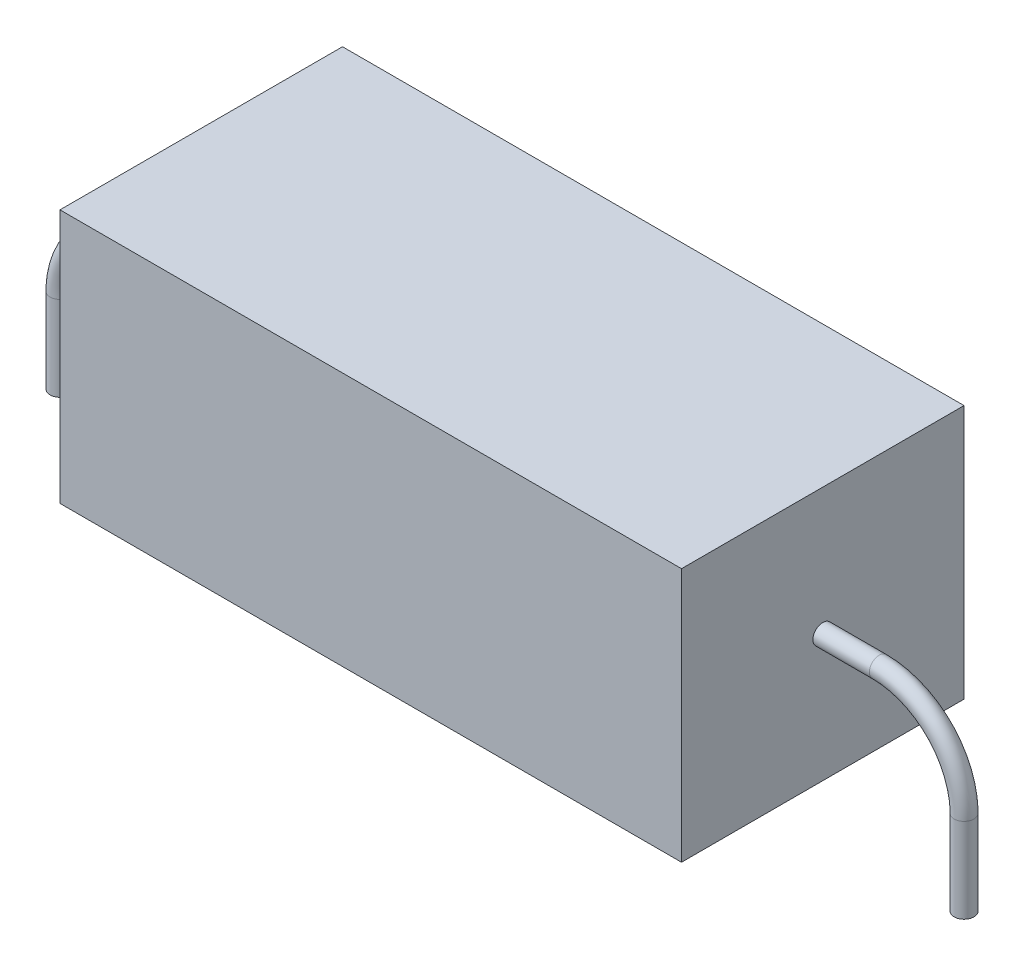
ISO-10303-21;
HEADER;
FILE_DESCRIPTION(('STEP AP214'),'2;1');
FILE_NAME('part.step','',(''),(''),'','','');
FILE_SCHEMA(('AUTOMOTIVE_DESIGN { 1 0 10303 214 1 1 1 1 }'));
ENDSEC;
DATA;
#1=APPLICATION_CONTEXT('core data for automotive mechanical design processes');
#2=APPLICATION_PROTOCOL_DEFINITION('international standard','automotive_design',2000,#1);
#3=PRODUCT_CONTEXT('',#1,'mechanical');
#4=PRODUCT('Part','Part','',(#3));
#5=PRODUCT_RELATED_PRODUCT_CATEGORY('part','',(#4));
#6=PRODUCT_DEFINITION_FORMATION('','',#4);
#7=PRODUCT_DEFINITION_CONTEXT('part definition',#1,'design');
#8=PRODUCT_DEFINITION('design','',#6,#7);
#9=PRODUCT_DEFINITION_SHAPE('','',#8);
#10=(LENGTH_UNIT() NAMED_UNIT(*) SI_UNIT(.MILLI.,.METRE.));
#11=(NAMED_UNIT(*) PLANE_ANGLE_UNIT() SI_UNIT($,.RADIAN.));
#12=(NAMED_UNIT(*) SI_UNIT($,.STERADIAN.) SOLID_ANGLE_UNIT());
#13=UNCERTAINTY_MEASURE_WITH_UNIT(LENGTH_MEASURE(1.E-05),#10,'distance_accuracy_value','');
#14=(GEOMETRIC_REPRESENTATION_CONTEXT(3) GLOBAL_UNCERTAINTY_ASSIGNED_CONTEXT((#13)) GLOBAL_UNIT_ASSIGNED_CONTEXT((#10,
#11,#12)) REPRESENTATION_CONTEXT('',''));
#15=CARTESIAN_POINT('',(0.,0.,0.));
#16=DIRECTION('',(0.,0.,1.));
#17=DIRECTION('',(1.,0.,0.));
#18=AXIS2_PLACEMENT_3D('',#15,#16,#17);
#19=CARTESIAN_POINT('',(16.,-6.,0.));
#20=DIRECTION('',(0.,-1.,0.));
#21=DIRECTION('',(1.,0.,0.));
#22=AXIS2_PLACEMENT_3D('',#19,#20,#21);
#23=PLANE('',#22);
#24=CARTESIAN_POINT('',(16.,-6.,0.));
#25=DIRECTION('',(0.,-1.,0.));
#26=DIRECTION('',(0.,0.,-1.));
#27=AXIS2_PLACEMENT_3D('',#24,#25,#26);
#28=CIRCLE('',#27,0.35);
#29=CARTESIAN_POINT('',(16.,-6.,-0.35));
#30=VERTEX_POINT('',#29);
#31=EDGE_CURVE('E20',#30,#30,#28,.F.);
#32=ORIENTED_EDGE('',*,*,#31,.F.);
#33=EDGE_LOOP('',(#32));
#34=FACE_BOUND('',#33,.T.);
#35=ADVANCED_FACE('F17',(#34),#23,.T.);
#36=CARTESIAN_POINT('',(-16.,-6.,0.));
#37=DIRECTION('',(0.,-1.,0.));
#38=DIRECTION('',(1.,0.,0.));
#39=AXIS2_PLACEMENT_3D('',#36,#37,#38);
#40=PLANE('',#39);
#41=CARTESIAN_POINT('',(-16.,-6.,0.));
#42=DIRECTION('',(0.,-1.,0.));
#43=DIRECTION('',(0.,0.,-1.));
#44=AXIS2_PLACEMENT_3D('',#41,#42,#43);
#45=CIRCLE('',#44,0.35);
#46=CARTESIAN_POINT('',(-16.,-6.,-0.35));
#47=VERTEX_POINT('',#46);
#48=EDGE_CURVE('E164',#47,#47,#45,.F.);
#49=ORIENTED_EDGE('',*,*,#48,.F.);
#50=EDGE_LOOP('',(#49));
#51=FACE_BOUND('',#50,.T.);
#52=ADVANCED_FACE('F114',(#51),#40,.T.);
#53=CARTESIAN_POINT('',(16.,-3.,0.));
#54=DIRECTION('',(0.,-1.,0.));
#55=DIRECTION('',(0.,0.,-1.));
#56=AXIS2_PLACEMENT_3D('',#53,#54,#55);
#57=CYLINDRICAL_SURFACE('',#56,0.35);
#58=ORIENTED_EDGE('',*,*,#31,.T.);
#59=EDGE_LOOP('',(#58));
#60=FACE_BOUND('',#59,.T.);
#61=CARTESIAN_POINT('',(16.,-3.,0.));
#62=DIRECTION('',(0.,-1.,0.));
#63=DIRECTION('',(1.,0.,0.));
#64=AXIS2_PLACEMENT_3D('',#61,#62,#63);
#65=CIRCLE('',#64,0.35);
#66=CARTESIAN_POINT('',(16.35,-3.,0.));
#67=VERTEX_POINT('',#66);
#68=EDGE_CURVE('E162',#67,#67,#65,.F.);
#69=ORIENTED_EDGE('',*,*,#68,.F.);
#70=EDGE_LOOP('',(#69));
#71=FACE_BOUND('',#70,.T.);
#72=ADVANCED_FACE('F111',(#60,#71),#57,.T.);
#73=CARTESIAN_POINT('',(-16.,-3.,0.));
#74=DIRECTION('',(0.,-1.,0.));
#75=DIRECTION('',(0.,0.,-1.));
#76=AXIS2_PLACEMENT_3D('',#73,#74,#75);
#77=CYLINDRICAL_SURFACE('',#76,0.35);
#78=CARTESIAN_POINT('',(-16.,-3.,0.));
#79=DIRECTION('',(0.,-1.,0.));
#80=DIRECTION('',(-1.,0.,0.));
#81=AXIS2_PLACEMENT_3D('',#78,#79,#80);
#82=CIRCLE('',#81,0.35);
#83=CARTESIAN_POINT('',(-16.35,-3.,0.));
#84=VERTEX_POINT('',#83);
#85=EDGE_CURVE('E91',#84,#84,#82,.F.);
#86=ORIENTED_EDGE('',*,*,#85,.F.);
#87=EDGE_LOOP('',(#86));
#88=FACE_BOUND('',#87,.T.);
#89=ORIENTED_EDGE('',*,*,#48,.T.);
#90=EDGE_LOOP('',(#89));
#91=FACE_BOUND('',#90,.T.);
#92=ADVANCED_FACE('F107',(#88,#91),#77,.T.);
#93=CARTESIAN_POINT('',(13.,-3.,0.));
#94=DIRECTION('',(0.,0.,-1.));
#95=DIRECTION('',(-1.,0.,0.));
#96=AXIS2_PLACEMENT_3D('',#93,#94,#95);
#97=TOROIDAL_SURFACE('',#96,3.,0.35);
#98=ORIENTED_EDGE('',*,*,#68,.T.);
#99=EDGE_LOOP('',(#98));
#100=FACE_BOUND('',#99,.T.);
#101=CARTESIAN_POINT('',(13.,0.,0.));
#102=DIRECTION('',(1.,0.,0.));
#103=DIRECTION('',(0.,1.,0.));
#104=AXIS2_PLACEMENT_3D('',#101,#102,#103);
#105=CIRCLE('',#104,0.35);
#106=CARTESIAN_POINT('',(13.,0.35,0.));
#107=VERTEX_POINT('',#106);
#108=EDGE_CURVE('E88',#107,#107,#105,.F.);
#109=ORIENTED_EDGE('',*,*,#108,.F.);
#110=EDGE_LOOP('',(#109));
#111=FACE_BOUND('',#110,.T.);
#112=ADVANCED_FACE('F102',(#100,#111),#97,.T.);
#113=CARTESIAN_POINT('',(-13.,-3.,0.));
#114=DIRECTION('',(0.,0.,1.));
#115=DIRECTION('',(1.,0.,0.));
#116=AXIS2_PLACEMENT_3D('',#113,#114,#115);
#117=TOROIDAL_SURFACE('',#116,3.,0.35);
#118=ORIENTED_EDGE('',*,*,#85,.T.);
#119=EDGE_LOOP('',(#118));
#120=FACE_BOUND('',#119,.T.);
#121=CARTESIAN_POINT('',(-13.,0.,0.));
#122=DIRECTION('',(-1.,0.,0.));
#123=DIRECTION('',(0.,-1.,0.));
#124=AXIS2_PLACEMENT_3D('',#121,#122,#123);
#125=CIRCLE('',#124,0.35);
#126=CARTESIAN_POINT('',(-13.,-0.35,0.));
#127=VERTEX_POINT('',#126);
#128=EDGE_CURVE('E74',#127,#127,#125,.F.);
#129=ORIENTED_EDGE('',*,*,#128,.F.);
#130=EDGE_LOOP('',(#129));
#131=FACE_BOUND('',#130,.T.);
#132=ADVANCED_FACE('F97',(#120,#131),#117,.T.);
#133=CARTESIAN_POINT('',(11.,0.,0.));
#134=DIRECTION('',(1.,0.,0.));
#135=DIRECTION('',(0.,1.,0.));
#136=AXIS2_PLACEMENT_3D('',#133,#134,#135);
#137=CYLINDRICAL_SURFACE('',#136,0.35);
#138=ORIENTED_EDGE('',*,*,#108,.T.);
#139=EDGE_LOOP('',(#138));
#140=FACE_BOUND('',#139,.T.);
#141=CARTESIAN_POINT('',(11.,0.,0.));
#142=DIRECTION('',(1.,0.,0.));
#143=DIRECTION('',(0.,1.,0.));
#144=AXIS2_PLACEMENT_3D('',#141,#142,#143);
#145=CIRCLE('',#144,0.35);
#146=CARTESIAN_POINT('',(11.,0.35,0.));
#147=VERTEX_POINT('',#146);
#148=EDGE_CURVE('E66',#147,#147,#145,.T.);
#149=ORIENTED_EDGE('',*,*,#148,.T.);
#150=EDGE_LOOP('',(#149));
#151=FACE_BOUND('',#150,.T.);
#152=ADVANCED_FACE('F101',(#140,#151),#137,.T.);
#153=CARTESIAN_POINT('',(-11.,0.,0.));
#154=DIRECTION('',(-1.,0.,0.));
#155=DIRECTION('',(0.,-1.,0.));
#156=AXIS2_PLACEMENT_3D('',#153,#154,#155);
#157=CYLINDRICAL_SURFACE('',#156,0.35);
#158=CARTESIAN_POINT('',(-11.,0.,0.));
#159=DIRECTION('',(-1.,0.,0.));
#160=DIRECTION('',(0.,-1.,0.));
#161=AXIS2_PLACEMENT_3D('',#158,#159,#160);
#162=CIRCLE('',#161,0.35);
#163=CARTESIAN_POINT('',(-11.,-0.35,0.));
#164=VERTEX_POINT('',#163);
#165=EDGE_CURVE('E154',#164,#164,#162,.F.);
#166=ORIENTED_EDGE('',*,*,#165,.F.);
#167=EDGE_LOOP('',(#166));
#168=FACE_BOUND('',#167,.T.);
#169=ORIENTED_EDGE('',*,*,#128,.T.);
#170=EDGE_LOOP('',(#169));
#171=FACE_BOUND('',#170,.T.);
#172=ADVANCED_FACE('F144',(#168,#171),#157,.T.);
#173=CARTESIAN_POINT('',(-11.,4.5,5.));
#174=DIRECTION('',(0.,1.,0.));
#175=DIRECTION('',(0.,0.,1.));
#176=AXIS2_PLACEMENT_3D('',#173,#174,#175);
#177=PLANE('',#176);
#178=DIRECTION('',(-1.,0.,0.));
#179=VECTOR('',#178,1.);
#180=CARTESIAN_POINT('',(-11.,4.5,-5.));
#181=LINE('',#180,#179);
#182=CARTESIAN_POINT('',(-11.,4.5,-5.));
#183=VERTEX_POINT('',#182);
#184=CARTESIAN_POINT('',(11.,4.5,-5.));
#185=VERTEX_POINT('',#184);
#186=EDGE_CURVE('E61',#183,#185,#181,.F.);
#187=ORIENTED_EDGE('',*,*,#186,.F.);
#188=DIRECTION('',(0.,0.,1.));
#189=VECTOR('',#188,1.);
#190=CARTESIAN_POINT('',(-11.,4.5,0.));
#191=LINE('',#190,#189);
#192=CARTESIAN_POINT('',(-11.,4.5,5.));
#193=VERTEX_POINT('',#192);
#194=EDGE_CURVE('E180',#193,#183,#191,.F.);
#195=ORIENTED_EDGE('',*,*,#194,.F.);
#196=DIRECTION('',(1.,0.,0.));
#197=VECTOR('',#196,1.);
#198=CARTESIAN_POINT('',(-11.,4.5,5.));
#199=LINE('',#198,#197);
#200=CARTESIAN_POINT('',(11.,4.5,5.));
#201=VERTEX_POINT('',#200);
#202=EDGE_CURVE('E63',#201,#193,#199,.F.);
#203=ORIENTED_EDGE('',*,*,#202,.F.);
#204=DIRECTION('',(0.,0.,1.));
#205=VECTOR('',#204,1.);
#206=CARTESIAN_POINT('',(11.,4.5,0.));
#207=LINE('',#206,#205);
#208=EDGE_CURVE('E55',#201,#185,#207,.F.);
#209=ORIENTED_EDGE('',*,*,#208,.T.);
#210=EDGE_LOOP('',(#187,#195,#203,#209));
#211=FACE_BOUND('',#210,.T.);
#212=ADVANCED_FACE('F59',(#211),#177,.T.);
#213=CARTESIAN_POINT('',(-11.,-4.5,-5.));
#214=DIRECTION('',(0.,0.,-1.));
#215=DIRECTION('',(-1.,0.,0.));
#216=AXIS2_PLACEMENT_3D('',#213,#214,#215);
#217=PLANE('',#216);
#218=DIRECTION('',(1.,0.,0.));
#219=VECTOR('',#218,1.);
#220=CARTESIAN_POINT('',(-11.,-4.5,-5.));
#221=LINE('',#220,#219);
#222=CARTESIAN_POINT('',(-11.,-4.5,-5.));
#223=VERTEX_POINT('',#222);
#224=CARTESIAN_POINT('',(11.,-4.5,-5.));
#225=VERTEX_POINT('',#224);
#226=EDGE_CURVE('E182',#223,#225,#221,.T.);
#227=ORIENTED_EDGE('',*,*,#226,.F.);
#228=DIRECTION('',(0.,1.,0.));
#229=VECTOR('',#228,1.);
#230=CARTESIAN_POINT('',(-11.,0.,-5.));
#231=LINE('',#230,#229);
#232=EDGE_CURVE('E72',#183,#223,#231,.F.);
#233=ORIENTED_EDGE('',*,*,#232,.F.);
#234=ORIENTED_EDGE('',*,*,#186,.T.);
#235=DIRECTION('',(0.,1.,0.));
#236=VECTOR('',#235,1.);
#237=CARTESIAN_POINT('',(11.,0.,-5.));
#238=LINE('',#237,#236);
#239=EDGE_CURVE('E65',#185,#225,#238,.F.);
#240=ORIENTED_EDGE('',*,*,#239,.T.);
#241=EDGE_LOOP('',(#227,#233,#234,#240));
#242=FACE_BOUND('',#241,.T.);
#243=ADVANCED_FACE('F69',(#242),#217,.T.);
#244=CARTESIAN_POINT('',(11.,0.,0.));
#245=DIRECTION('',(-1.,0.,0.));
#246=DIRECTION('',(0.,0.,1.));
#247=AXIS2_PLACEMENT_3D('',#244,#245,#246);
#248=PLANE('',#247);
#249=ORIENTED_EDGE('',*,*,#208,.F.);
#250=DIRECTION('',(0.,1.,0.));
#251=VECTOR('',#250,1.);
#252=CARTESIAN_POINT('',(11.,-4.5,5.));
#253=LINE('',#252,#251);
#254=CARTESIAN_POINT('',(11.,-4.5,5.));
#255=VERTEX_POINT('',#254);
#256=EDGE_CURVE('E81',#255,#201,#253,.T.);
#257=ORIENTED_EDGE('',*,*,#256,.F.);
#258=DIRECTION('',(0.,0.,-1.));
#259=VECTOR('',#258,1.);
#260=CARTESIAN_POINT('',(11.,-4.5,5.));
#261=LINE('',#260,#259);
#262=EDGE_CURVE('E79',#225,#255,#261,.F.);
#263=ORIENTED_EDGE('',*,*,#262,.F.);
#264=ORIENTED_EDGE('',*,*,#239,.F.);
#265=EDGE_LOOP('',(#249,#257,#263,#264));
#266=FACE_BOUND('',#265,.T.);
#267=ORIENTED_EDGE('',*,*,#148,.F.);
#268=EDGE_LOOP('',(#267));
#269=FACE_BOUND('',#268,.T.);
#270=ADVANCED_FACE('F76',(#266,#269),#248,.F.);
#271=CARTESIAN_POINT('',(-11.,-4.5,5.));
#272=DIRECTION('',(0.,0.,1.));
#273=DIRECTION('',(1.,0.,0.));
#274=AXIS2_PLACEMENT_3D('',#271,#272,#273);
#275=PLANE('',#274);
#276=ORIENTED_EDGE('',*,*,#202,.T.);
#277=DIRECTION('',(0.,1.,0.));
#278=VECTOR('',#277,1.);
#279=CARTESIAN_POINT('',(-11.,0.,5.));
#280=LINE('',#279,#278);
#281=CARTESIAN_POINT('',(-11.,-4.5,5.));
#282=VERTEX_POINT('',#281);
#283=EDGE_CURVE('E35',#282,#193,#280,.T.);
#284=ORIENTED_EDGE('',*,*,#283,.F.);
#285=DIRECTION('',(1.,0.,0.));
#286=VECTOR('',#285,1.);
#287=CARTESIAN_POINT('',(-11.,-4.5,5.));
#288=LINE('',#287,#286);
#289=EDGE_CURVE('E26',#255,#282,#288,.F.);
#290=ORIENTED_EDGE('',*,*,#289,.F.);
#291=ORIENTED_EDGE('',*,*,#256,.T.);
#292=EDGE_LOOP('',(#276,#284,#290,#291));
#293=FACE_BOUND('',#292,.T.);
#294=ADVANCED_FACE('F132',(#293),#275,.T.);
#295=CARTESIAN_POINT('',(-11.,0.,0.));
#296=DIRECTION('',(-1.,0.,0.));
#297=DIRECTION('',(0.,0.,1.));
#298=AXIS2_PLACEMENT_3D('',#295,#296,#297);
#299=PLANE('',#298);
#300=ORIENTED_EDGE('',*,*,#283,.T.);
#301=ORIENTED_EDGE('',*,*,#194,.T.);
#302=ORIENTED_EDGE('',*,*,#232,.T.);
#303=DIRECTION('',(0.,0.,-1.));
#304=VECTOR('',#303,1.);
#305=CARTESIAN_POINT('',(-11.,-4.5,5.));
#306=LINE('',#305,#304);
#307=EDGE_CURVE('E11',#282,#223,#306,.T.);
#308=ORIENTED_EDGE('',*,*,#307,.F.);
#309=EDGE_LOOP('',(#300,#301,#302,#308));
#310=FACE_BOUND('',#309,.T.);
#311=ORIENTED_EDGE('',*,*,#165,.T.);
#312=EDGE_LOOP('',(#311));
#313=FACE_BOUND('',#312,.T.);
#314=ADVANCED_FACE('F126',(#310,#313),#299,.T.);
#315=CARTESIAN_POINT('',(-11.,-4.5,5.));
#316=DIRECTION('',(0.,-1.,0.));
#317=DIRECTION('',(0.,0.,-1.));
#318=AXIS2_PLACEMENT_3D('',#315,#316,#317);
#319=PLANE('',#318);
#320=ORIENTED_EDGE('',*,*,#289,.T.);
#321=ORIENTED_EDGE('',*,*,#307,.T.);
#322=ORIENTED_EDGE('',*,*,#226,.T.);
#323=ORIENTED_EDGE('',*,*,#262,.T.);
#324=EDGE_LOOP('',(#320,#321,#322,#323));
#325=FACE_BOUND('',#324,.T.);
#326=ADVANCED_FACE('F124',(#325),#319,.T.);
#327=CLOSED_SHELL('',(#35,#52,#72,#92,#112,#132,#152,#172,#212,#243,#270,#294,#314,#326));
#328=MANIFOLD_SOLID_BREP('B1',#327);
#329=ADVANCED_BREP_SHAPE_REPRESENTATION('',(#18,#328),#14);
#330=SHAPE_DEFINITION_REPRESENTATION(#9,#329);
ENDSEC;
END-ISO-10303-21;
